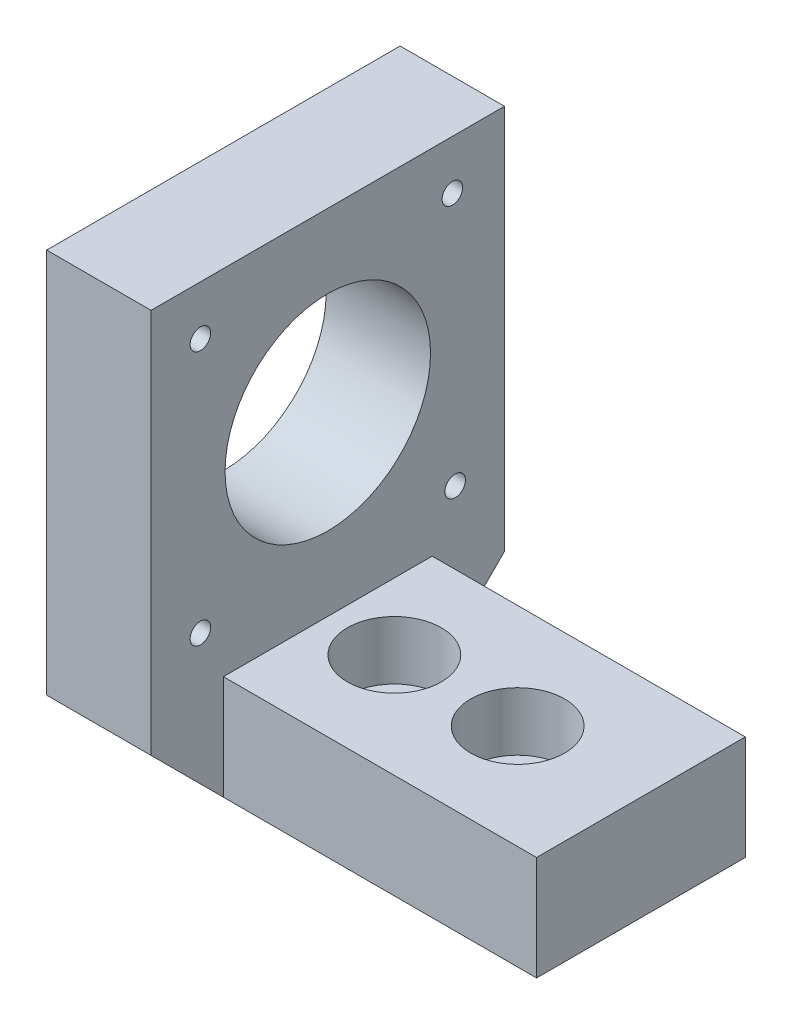
ISO-10303-21;
HEADER;
FILE_DESCRIPTION(('STEP AP214'),'2;1');
FILE_NAME('part.step','',(''),(''),'','','');
FILE_SCHEMA(('AUTOMOTIVE_DESIGN { 1 0 10303 214 1 1 1 1 }'));
ENDSEC;
DATA;
#1=APPLICATION_CONTEXT('core data for automotive mechanical design processes');
#2=APPLICATION_PROTOCOL_DEFINITION('international standard','automotive_design',2000,#1);
#3=PRODUCT_CONTEXT('',#1,'mechanical');
#4=PRODUCT('Part','Part','',(#3));
#5=PRODUCT_RELATED_PRODUCT_CATEGORY('part','',(#4));
#6=PRODUCT_DEFINITION_FORMATION('','',#4);
#7=PRODUCT_DEFINITION_CONTEXT('part definition',#1,'design');
#8=PRODUCT_DEFINITION('design','',#6,#7);
#9=PRODUCT_DEFINITION_SHAPE('','',#8);
#10=(LENGTH_UNIT() NAMED_UNIT(*) SI_UNIT(.MILLI.,.METRE.));
#11=(NAMED_UNIT(*) PLANE_ANGLE_UNIT() SI_UNIT($,.RADIAN.));
#12=(NAMED_UNIT(*) SI_UNIT($,.STERADIAN.) SOLID_ANGLE_UNIT());
#13=UNCERTAINTY_MEASURE_WITH_UNIT(LENGTH_MEASURE(1.E-05),#10,'distance_accuracy_value','');
#14=(GEOMETRIC_REPRESENTATION_CONTEXT(3) GLOBAL_UNCERTAINTY_ASSIGNED_CONTEXT((#13)) GLOBAL_UNIT_ASSIGNED_CONTEXT((#10,
#11,#12)) REPRESENTATION_CONTEXT('',''));
#15=CARTESIAN_POINT('',(0.,0.,0.));
#16=DIRECTION('',(0.,0.,1.));
#17=DIRECTION('',(1.,0.,0.));
#18=AXIS2_PLACEMENT_3D('',#15,#16,#17);
#19=CARTESIAN_POINT('',(10.4,12.7,0.));
#20=DIRECTION('',(0.,1.,0.));
#21=DIRECTION('',(0.,0.,1.));
#22=AXIS2_PLACEMENT_3D('',#19,#20,#21);
#23=CYLINDRICAL_SURFACE('',#22,3.3782);
#24=CARTESIAN_POINT('',(10.4,0.,0.));
#25=DIRECTION('',(0.,1.,0.));
#26=DIRECTION('',(0.,0.,1.));
#27=AXIS2_PLACEMENT_3D('',#24,#25,#26);
#28=CIRCLE('',#27,3.3782);
#29=CARTESIAN_POINT('',(10.4,0.,3.3782));
#30=VERTEX_POINT('',#29);
#31=EDGE_CURVE('E268',#30,#30,#28,.T.);
#32=ORIENTED_EDGE('',*,*,#31,.F.);
#33=EDGE_LOOP('',(#32));
#34=FACE_BOUND('',#33,.T.);
#35=CARTESIAN_POINT('',(10.4,5.588,0.));
#36=DIRECTION('',(0.,1.,0.));
#37=DIRECTION('',(0.,0.,1.));
#38=AXIS2_PLACEMENT_3D('',#35,#36,#37);
#39=CIRCLE('',#38,3.3782);
#40=CARTESIAN_POINT('',(10.4,5.588,3.3782));
#41=VERTEX_POINT('',#40);
#42=EDGE_CURVE('E52',#41,#41,#39,.F.);
#43=ORIENTED_EDGE('',*,*,#42,.F.);
#44=EDGE_LOOP('',(#43));
#45=FACE_BOUND('',#44,.T.);
#46=ADVANCED_FACE('F47',(#34,#45),#23,.F.);
#47=CARTESIAN_POINT('',(-4.6,12.7,0.));
#48=DIRECTION('',(0.,1.,0.));
#49=DIRECTION('',(0.,0.,1.));
#50=AXIS2_PLACEMENT_3D('',#47,#48,#49);
#51=CYLINDRICAL_SURFACE('',#50,3.3782);
#52=CARTESIAN_POINT('',(-4.6,0.,0.));
#53=DIRECTION('',(0.,1.,0.));
#54=DIRECTION('',(0.,0.,1.));
#55=AXIS2_PLACEMENT_3D('',#52,#53,#54);
#56=CIRCLE('',#55,3.3782);
#57=CARTESIAN_POINT('',(-4.6,0.,3.3782));
#58=VERTEX_POINT('',#57);
#59=EDGE_CURVE('E247',#58,#58,#56,.T.);
#60=ORIENTED_EDGE('',*,*,#59,.F.);
#61=EDGE_LOOP('',(#60));
#62=FACE_BOUND('',#61,.T.);
#63=CARTESIAN_POINT('',(-4.6,5.588,0.));
#64=DIRECTION('',(0.,1.,0.));
#65=DIRECTION('',(0.,0.,1.));
#66=AXIS2_PLACEMENT_3D('',#63,#64,#65);
#67=CIRCLE('',#66,3.3782);
#68=CARTESIAN_POINT('',(-4.6,5.588,3.3782));
#69=VERTEX_POINT('',#68);
#70=EDGE_CURVE('E238',#69,#69,#67,.F.);
#71=ORIENTED_EDGE('',*,*,#70,.F.);
#72=EDGE_LOOP('',(#71));
#73=FACE_BOUND('',#72,.T.);
#74=ADVANCED_FACE('F318',(#62,#73),#51,.F.);
#75=CARTESIAN_POINT('',(0.,0.,0.));
#76=DIRECTION('',(0.,-1.,0.));
#77=DIRECTION('',(0.,0.,-1.));
#78=AXIS2_PLACEMENT_3D('',#75,#76,#77);
#79=PLANE('',#78);
#80=ORIENTED_EDGE('',*,*,#59,.T.);
#81=EDGE_LOOP('',(#80));
#82=FACE_BOUND('',#81,.T.);
#83=DIRECTION('',(0.,0.,-1.));
#84=VECTOR('',#83,1.);
#85=CARTESIAN_POINT('',(25.4,0.,12.7));
#86=LINE('',#85,#84);
#87=CARTESIAN_POINT('',(25.4,0.,12.7));
#88=VERTEX_POINT('',#87);
#89=CARTESIAN_POINT('',(25.4,0.,-12.7));
#90=VERTEX_POINT('',#89);
#91=EDGE_CURVE('E166',#88,#90,#86,.T.);
#92=ORIENTED_EDGE('',*,*,#91,.F.);
#93=DIRECTION('',(1.,0.,0.));
#94=VECTOR('',#93,1.);
#95=CARTESIAN_POINT('',(-25.4,0.,12.7));
#96=LINE('',#95,#94);
#97=CARTESIAN_POINT('',(-12.7,0.,12.7));
#98=VERTEX_POINT('',#97);
#99=EDGE_CURVE('E193',#98,#88,#96,.T.);
#100=ORIENTED_EDGE('',*,*,#99,.F.);
#101=CARTESIAN_POINT('',(-25.4,0.,12.7));
#102=VERTEX_POINT('',#101);
#103=EDGE_CURVE('E173',#102,#98,#96,.T.);
#104=ORIENTED_EDGE('',*,*,#103,.F.);
#105=DIRECTION('',(0.,0.,1.));
#106=VECTOR('',#105,1.);
#107=CARTESIAN_POINT('',(-25.4,0.,12.7));
#108=LINE('',#107,#106);
#109=CARTESIAN_POINT('',(-25.4,0.,-12.7));
#110=VERTEX_POINT('',#109);
#111=EDGE_CURVE('E189',#110,#102,#108,.T.);
#112=ORIENTED_EDGE('',*,*,#111,.F.);
#113=DIRECTION('',(-1.,0.,0.));
#114=VECTOR('',#113,1.);
#115=CARTESIAN_POINT('',(-25.4,0.,-12.7));
#116=LINE('',#115,#114);
#117=CARTESIAN_POINT('',(-12.7,0.,-12.7));
#118=VERTEX_POINT('',#117);
#119=EDGE_CURVE('E184',#118,#110,#116,.T.);
#120=ORIENTED_EDGE('',*,*,#119,.F.);
#121=EDGE_CURVE('E185',#90,#118,#116,.T.);
#122=ORIENTED_EDGE('',*,*,#121,.F.);
#123=EDGE_LOOP('',(#92,#100,#104,#112,#120,#122));
#124=FACE_BOUND('',#123,.T.);
#125=ORIENTED_EDGE('',*,*,#31,.T.);
#126=EDGE_LOOP('',(#125));
#127=FACE_BOUND('',#126,.T.);
#128=ADVANCED_FACE('F325',(#82,#124,#127),#79,.T.);
#129=CARTESIAN_POINT('',(25.4,12.7,12.7));
#130=DIRECTION('',(-1.,0.,0.));
#131=DIRECTION('',(0.,0.,1.));
#132=AXIS2_PLACEMENT_3D('',#129,#130,#131);
#133=PLANE('',#132);
#134=ORIENTED_EDGE('',*,*,#91,.T.);
#135=DIRECTION('',(0.,-1.,0.));
#136=VECTOR('',#135,1.);
#137=CARTESIAN_POINT('',(25.4,12.7,-12.7));
#138=LINE('',#137,#136);
#139=CARTESIAN_POINT('',(25.4,12.7,-12.7));
#140=VERTEX_POINT('',#139);
#141=EDGE_CURVE('E158',#140,#90,#138,.T.);
#142=ORIENTED_EDGE('',*,*,#141,.F.);
#143=DIRECTION('',(0.,0.,-1.));
#144=VECTOR('',#143,1.);
#145=CARTESIAN_POINT('',(25.4,12.7,12.7));
#146=LINE('',#145,#144);
#147=CARTESIAN_POINT('',(25.4,12.7,12.7));
#148=VERTEX_POINT('',#147);
#149=EDGE_CURVE('E168',#148,#140,#146,.T.);
#150=ORIENTED_EDGE('',*,*,#149,.F.);
#151=DIRECTION('',(0.,-1.,0.));
#152=VECTOR('',#151,1.);
#153=CARTESIAN_POINT('',(25.4,12.7,12.7));
#154=LINE('',#153,#152);
#155=EDGE_CURVE('E180',#148,#88,#154,.T.);
#156=ORIENTED_EDGE('',*,*,#155,.T.);
#157=EDGE_LOOP('',(#134,#142,#150,#156));
#158=FACE_BOUND('',#157,.T.);
#159=ADVANCED_FACE('F312',(#158),#133,.F.);
#160=CARTESIAN_POINT('',(-25.4,12.7,-12.7));
#161=DIRECTION('',(0.,0.,1.));
#162=DIRECTION('',(1.,0.,0.));
#163=AXIS2_PLACEMENT_3D('',#160,#161,#162);
#164=PLANE('',#163);
#165=ORIENTED_EDGE('',*,*,#121,.T.);
#166=DIRECTION('',(0.,1.,0.));
#167=VECTOR('',#166,1.);
#168=CARTESIAN_POINT('',(-12.7,12.7,-12.7));
#169=LINE('',#168,#167);
#170=CARTESIAN_POINT('',(-12.7,12.7,-12.7));
#171=VERTEX_POINT('',#170);
#172=EDGE_CURVE('E206',#118,#171,#169,.T.);
#173=ORIENTED_EDGE('',*,*,#172,.T.);
#174=DIRECTION('',(-1.,0.,0.));
#175=VECTOR('',#174,1.);
#176=CARTESIAN_POINT('',(-25.4,12.7,-12.7));
#177=LINE('',#176,#175);
#178=EDGE_CURVE('E172',#140,#171,#177,.T.);
#179=ORIENTED_EDGE('',*,*,#178,.F.);
#180=ORIENTED_EDGE('',*,*,#141,.T.);
#181=EDGE_LOOP('',(#165,#173,#179,#180));
#182=FACE_BOUND('',#181,.T.);
#183=ADVANCED_FACE('F300',(#182),#164,.F.);
#184=CARTESIAN_POINT('',(-25.4,12.7,12.7));
#185=DIRECTION('',(1.,0.,0.));
#186=DIRECTION('',(0.,0.,-1.));
#187=AXIS2_PLACEMENT_3D('',#184,#185,#186);
#188=PLANE('',#187);
#189=CARTESIAN_POINT('',(-25.4,49.7,-15.1608250543533));
#190=DIRECTION('',(-1.,0.,0.));
#191=DIRECTION('',(0.,0.,1.));
#192=AXIS2_PLACEMENT_3D('',#189,#190,#191);
#193=CIRCLE('',#192,1.25);
#194=CARTESIAN_POINT('',(-25.4,49.7,-13.9108250543533));
#195=VERTEX_POINT('',#194);
#196=EDGE_CURVE('E237',#195,#195,#193,.T.);
#197=ORIENTED_EDGE('',*,*,#196,.F.);
#198=EDGE_LOOP('',(#197));
#199=FACE_BOUND('',#198,.T.);
#200=CARTESIAN_POINT('',(-25.4,49.7,15.5));
#201=DIRECTION('',(-1.,0.,0.));
#202=DIRECTION('',(0.,0.,1.));
#203=AXIS2_PLACEMENT_3D('',#200,#201,#202);
#204=CIRCLE('',#203,1.25);
#205=CARTESIAN_POINT('',(-25.4,49.7,16.75));
#206=VERTEX_POINT('',#205);
#207=EDGE_CURVE('E233',#206,#206,#204,.T.);
#208=ORIENTED_EDGE('',*,*,#207,.F.);
#209=EDGE_LOOP('',(#208));
#210=FACE_BOUND('',#209,.T.);
#211=CARTESIAN_POINT('',(-25.4,18.7,15.5));
#212=DIRECTION('',(-1.,0.,0.));
#213=DIRECTION('',(0.,0.,1.));
#214=AXIS2_PLACEMENT_3D('',#211,#212,#213);
#215=CIRCLE('',#214,1.25);
#216=CARTESIAN_POINT('',(-25.4,18.7,16.75));
#217=VERTEX_POINT('',#216);
#218=EDGE_CURVE('E228',#217,#217,#215,.T.);
#219=ORIENTED_EDGE('',*,*,#218,.F.);
#220=EDGE_LOOP('',(#219));
#221=FACE_BOUND('',#220,.T.);
#222=CARTESIAN_POINT('',(-25.4,18.7,-15.5));
#223=DIRECTION('',(-1.,0.,0.));
#224=DIRECTION('',(0.,0.,1.));
#225=AXIS2_PLACEMENT_3D('',#222,#223,#224);
#226=CIRCLE('',#225,1.25);
#227=CARTESIAN_POINT('',(-25.4,18.7,-14.25));
#228=VERTEX_POINT('',#227);
#229=EDGE_CURVE('E227',#228,#228,#226,.T.);
#230=ORIENTED_EDGE('',*,*,#229,.F.);
#231=EDGE_LOOP('',(#230));
#232=FACE_BOUND('',#231,.T.);
#233=ORIENTED_EDGE('',*,*,#111,.T.);
#234=DIRECTION('',(0.,0.707106781186544,0.707106781186551));
#235=VECTOR('',#234,1.);
#236=CARTESIAN_POINT('',(-25.4,6.34999999999989,19.05));
#237=LINE('',#236,#235);
#238=CARTESIAN_POINT('',(-25.4,8.79999999999982,21.5));
#239=VERTEX_POINT('',#238);
#240=EDGE_CURVE('E214',#102,#239,#237,.T.);
#241=ORIENTED_EDGE('',*,*,#240,.T.);
#242=DIRECTION('',(0.,1.,0.));
#243=VECTOR('',#242,1.);
#244=CARTESIAN_POINT('',(-25.4,12.7,21.5));
#245=LINE('',#244,#243);
#246=CARTESIAN_POINT('',(-25.4,55.7,21.5));
#247=VERTEX_POINT('',#246);
#248=EDGE_CURVE('E159',#239,#247,#245,.T.);
#249=ORIENTED_EDGE('',*,*,#248,.T.);
#250=DIRECTION('',(0.,0.,-1.));
#251=VECTOR('',#250,1.);
#252=CARTESIAN_POINT('',(-25.4,55.7,-21.5));
#253=LINE('',#252,#251);
#254=CARTESIAN_POINT('',(-25.4,55.7,-21.5));
#255=VERTEX_POINT('',#254);
#256=EDGE_CURVE('E126',#247,#255,#253,.T.);
#257=ORIENTED_EDGE('',*,*,#256,.T.);
#258=DIRECTION('',(0.,-1.,0.));
#259=VECTOR('',#258,1.);
#260=CARTESIAN_POINT('',(-25.4,12.7,-21.5));
#261=LINE('',#260,#259);
#262=CARTESIAN_POINT('',(-25.4,8.79999999999982,-21.5));
#263=VERTEX_POINT('',#262);
#264=EDGE_CURVE('E74',#255,#263,#261,.T.);
#265=ORIENTED_EDGE('',*,*,#264,.T.);
#266=DIRECTION('',(0.,-0.707106781186544,0.707106781186551));
#267=VECTOR('',#266,1.);
#268=CARTESIAN_POINT('',(-25.4,-6.35000000000011,-6.34999999999991));
#269=LINE('',#268,#267);
#270=EDGE_CURVE('E58',#263,#110,#269,.T.);
#271=ORIENTED_EDGE('',*,*,#270,.T.);
#272=EDGE_LOOP('',(#233,#241,#249,#257,#265,#271));
#273=FACE_BOUND('',#272,.T.);
#274=CARTESIAN_POINT('',(-25.4,34.2,0.));
#275=DIRECTION('',(-1.,0.,0.));
#276=DIRECTION('',(0.,0.,1.));
#277=AXIS2_PLACEMENT_3D('',#274,#275,#276);
#278=CIRCLE('',#277,12.5);
#279=CARTESIAN_POINT('',(-25.4,34.2,12.5));
#280=VERTEX_POINT('',#279);
#281=EDGE_CURVE('E148',#280,#280,#278,.T.);
#282=ORIENTED_EDGE('',*,*,#281,.F.);
#283=EDGE_LOOP('',(#282));
#284=FACE_BOUND('',#283,.T.);
#285=ADVANCED_FACE('F297',(#199,#210,#221,#232,#273,#284),#188,.F.);
#286=CARTESIAN_POINT('',(-25.4,12.7,12.7));
#287=DIRECTION('',(0.,0.,-1.));
#288=DIRECTION('',(-1.,0.,0.));
#289=AXIS2_PLACEMENT_3D('',#286,#287,#288);
#290=PLANE('',#289);
#291=DIRECTION('',(1.,0.,0.));
#292=VECTOR('',#291,1.);
#293=CARTESIAN_POINT('',(-25.4,12.7,12.7));
#294=LINE('',#293,#292);
#295=CARTESIAN_POINT('',(-12.7,12.7,12.7));
#296=VERTEX_POINT('',#295);
#297=EDGE_CURVE('E177',#296,#148,#294,.T.);
#298=ORIENTED_EDGE('',*,*,#297,.F.);
#299=DIRECTION('',(0.,-1.,0.));
#300=VECTOR('',#299,1.);
#301=CARTESIAN_POINT('',(-12.7,12.7,12.7));
#302=LINE('',#301,#300);
#303=EDGE_CURVE('E157',#296,#98,#302,.T.);
#304=ORIENTED_EDGE('',*,*,#303,.T.);
#305=ORIENTED_EDGE('',*,*,#99,.T.);
#306=ORIENTED_EDGE('',*,*,#155,.F.);
#307=EDGE_LOOP('',(#298,#304,#305,#306));
#308=FACE_BOUND('',#307,.T.);
#309=ADVANCED_FACE('F299',(#308),#290,.F.);
#310=CARTESIAN_POINT('',(0.,12.7,0.));
#311=DIRECTION('',(0.,-1.,0.));
#312=DIRECTION('',(0.,0.,-1.));
#313=AXIS2_PLACEMENT_3D('',#310,#311,#312);
#314=PLANE('',#313);
#315=CARTESIAN_POINT('',(-4.6,12.7,0.));
#316=DIRECTION('',(0.,1.,0.));
#317=DIRECTION('',(0.,0.,1.));
#318=AXIS2_PLACEMENT_3D('',#315,#316,#317);
#319=CIRCLE('',#318,5.715);
#320=CARTESIAN_POINT('',(-4.6,12.7,5.715));
#321=VERTEX_POINT('',#320);
#322=EDGE_CURVE('E249',#321,#321,#319,.T.);
#323=ORIENTED_EDGE('',*,*,#322,.F.);
#324=EDGE_LOOP('',(#323));
#325=FACE_BOUND('',#324,.T.);
#326=CARTESIAN_POINT('',(10.4,12.7,0.));
#327=DIRECTION('',(0.,1.,0.));
#328=DIRECTION('',(0.,0.,1.));
#329=AXIS2_PLACEMENT_3D('',#326,#327,#328);
#330=CIRCLE('',#329,5.715);
#331=CARTESIAN_POINT('',(10.4,12.7,5.715));
#332=VERTEX_POINT('',#331);
#333=EDGE_CURVE('E255',#332,#332,#330,.T.);
#334=ORIENTED_EDGE('',*,*,#333,.F.);
#335=EDGE_LOOP('',(#334));
#336=FACE_BOUND('',#335,.T.);
#337=ORIENTED_EDGE('',*,*,#178,.T.);
#338=DIRECTION('',(0.,0.,1.));
#339=VECTOR('',#338,1.);
#340=CARTESIAN_POINT('',(-12.7,12.7,-21.5));
#341=LINE('',#340,#339);
#342=EDGE_CURVE('E153',#171,#296,#341,.T.);
#343=ORIENTED_EDGE('',*,*,#342,.T.);
#344=ORIENTED_EDGE('',*,*,#297,.T.);
#345=ORIENTED_EDGE('',*,*,#149,.T.);
#346=EDGE_LOOP('',(#337,#343,#344,#345));
#347=FACE_BOUND('',#346,.T.);
#348=ADVANCED_FACE('F308',(#325,#336,#347),#314,.F.);
#349=CARTESIAN_POINT('',(-12.7,12.7,21.5));
#350=DIRECTION('',(0.,0.,1.));
#351=DIRECTION('',(0.,-1.,0.));
#352=AXIS2_PLACEMENT_3D('',#349,#350,#351);
#353=PLANE('',#352);
#354=ORIENTED_EDGE('',*,*,#248,.F.);
#355=DIRECTION('',(1.,0.,0.));
#356=VECTOR('',#355,1.);
#357=CARTESIAN_POINT('',(-12.7,8.79999999999981,21.5));
#358=LINE('',#357,#356);
#359=CARTESIAN_POINT('',(-12.7,8.79999999999982,21.5));
#360=VERTEX_POINT('',#359);
#361=EDGE_CURVE('E141',#239,#360,#358,.T.);
#362=ORIENTED_EDGE('',*,*,#361,.T.);
#363=DIRECTION('',(0.,1.,0.));
#364=VECTOR('',#363,1.);
#365=CARTESIAN_POINT('',(-12.7,12.7,21.5));
#366=LINE('',#365,#364);
#367=CARTESIAN_POINT('',(-12.7,55.7,21.5));
#368=VERTEX_POINT('',#367);
#369=EDGE_CURVE('E135',#360,#368,#366,.T.);
#370=ORIENTED_EDGE('',*,*,#369,.T.);
#371=DIRECTION('',(-1.,0.,0.));
#372=VECTOR('',#371,1.);
#373=CARTESIAN_POINT('',(-12.7,55.7,21.5));
#374=LINE('',#373,#372);
#375=EDGE_CURVE('E122',#368,#247,#374,.T.);
#376=ORIENTED_EDGE('',*,*,#375,.T.);
#377=EDGE_LOOP('',(#354,#362,#370,#376));
#378=FACE_BOUND('',#377,.T.);
#379=ADVANCED_FACE('F139',(#378),#353,.T.);
#380=CARTESIAN_POINT('',(-12.7,12.7,-21.5));
#381=DIRECTION('',(0.,0.,-1.));
#382=DIRECTION('',(0.,1.,0.));
#383=AXIS2_PLACEMENT_3D('',#380,#381,#382);
#384=PLANE('',#383);
#385=ORIENTED_EDGE('',*,*,#264,.F.);
#386=DIRECTION('',(-1.,0.,0.));
#387=VECTOR('',#386,1.);
#388=CARTESIAN_POINT('',(-12.7,55.7,-21.5));
#389=LINE('',#388,#387);
#390=CARTESIAN_POINT('',(-12.7,55.7,-21.5));
#391=VERTEX_POINT('',#390);
#392=EDGE_CURVE('E131',#391,#255,#389,.T.);
#393=ORIENTED_EDGE('',*,*,#392,.F.);
#394=DIRECTION('',(0.,-1.,0.));
#395=VECTOR('',#394,1.);
#396=CARTESIAN_POINT('',(-12.7,12.7,-21.5));
#397=LINE('',#396,#395);
#398=CARTESIAN_POINT('',(-12.7,8.79999999999982,-21.5));
#399=VERTEX_POINT('',#398);
#400=EDGE_CURVE('E66',#391,#399,#397,.T.);
#401=ORIENTED_EDGE('',*,*,#400,.T.);
#402=DIRECTION('',(-1.,0.,0.));
#403=VECTOR('',#402,1.);
#404=CARTESIAN_POINT('',(-12.7,8.79999999999982,-21.5));
#405=LINE('',#404,#403);
#406=EDGE_CURVE('E218',#399,#263,#405,.T.);
#407=ORIENTED_EDGE('',*,*,#406,.T.);
#408=EDGE_LOOP('',(#385,#393,#401,#407));
#409=FACE_BOUND('',#408,.T.);
#410=ADVANCED_FACE('F355',(#409),#384,.T.);
#411=CARTESIAN_POINT('',(-12.7,55.7,-21.5));
#412=DIRECTION('',(0.,1.,0.));
#413=DIRECTION('',(0.,0.,1.));
#414=AXIS2_PLACEMENT_3D('',#411,#412,#413);
#415=PLANE('',#414);
#416=ORIENTED_EDGE('',*,*,#256,.F.);
#417=ORIENTED_EDGE('',*,*,#375,.F.);
#418=DIRECTION('',(0.,0.,-1.));
#419=VECTOR('',#418,1.);
#420=CARTESIAN_POINT('',(-12.7,55.7,-21.5));
#421=LINE('',#420,#419);
#422=EDGE_CURVE('E125',#368,#391,#421,.T.);
#423=ORIENTED_EDGE('',*,*,#422,.T.);
#424=ORIENTED_EDGE('',*,*,#392,.T.);
#425=EDGE_LOOP('',(#416,#417,#423,#424));
#426=FACE_BOUND('',#425,.T.);
#427=ADVANCED_FACE('F124',(#426),#415,.T.);
#428=CARTESIAN_POINT('',(-12.7,0.,0.));
#429=DIRECTION('',(1.,0.,0.));
#430=DIRECTION('',(0.,0.,-1.));
#431=AXIS2_PLACEMENT_3D('',#428,#429,#430);
#432=PLANE('',#431);
#433=CARTESIAN_POINT('',(-12.7,49.7,-15.1608250543533));
#434=DIRECTION('',(1.,0.,0.));
#435=DIRECTION('',(0.,0.,-1.));
#436=AXIS2_PLACEMENT_3D('',#433,#434,#435);
#437=CIRCLE('',#436,1.25);
#438=CARTESIAN_POINT('',(-12.7,49.7,-16.4108250543533));
#439=VERTEX_POINT('',#438);
#440=EDGE_CURVE('E234',#439,#439,#437,.T.);
#441=ORIENTED_EDGE('',*,*,#440,.F.);
#442=EDGE_LOOP('',(#441));
#443=FACE_BOUND('',#442,.T.);
#444=CARTESIAN_POINT('',(-12.7,49.7,15.5));
#445=DIRECTION('',(1.,0.,0.));
#446=DIRECTION('',(0.,0.,-1.));
#447=AXIS2_PLACEMENT_3D('',#444,#445,#446);
#448=CIRCLE('',#447,1.25);
#449=CARTESIAN_POINT('',(-12.7,49.7,14.25));
#450=VERTEX_POINT('',#449);
#451=EDGE_CURVE('E229',#450,#450,#448,.T.);
#452=ORIENTED_EDGE('',*,*,#451,.F.);
#453=EDGE_LOOP('',(#452));
#454=FACE_BOUND('',#453,.T.);
#455=CARTESIAN_POINT('',(-12.7,18.7,15.5));
#456=DIRECTION('',(1.,0.,0.));
#457=DIRECTION('',(0.,0.,-1.));
#458=AXIS2_PLACEMENT_3D('',#455,#456,#457);
#459=CIRCLE('',#458,1.25);
#460=CARTESIAN_POINT('',(-12.7,18.7,14.25));
#461=VERTEX_POINT('',#460);
#462=EDGE_CURVE('E223',#461,#461,#459,.T.);
#463=ORIENTED_EDGE('',*,*,#462,.F.);
#464=EDGE_LOOP('',(#463));
#465=FACE_BOUND('',#464,.T.);
#466=CARTESIAN_POINT('',(-12.7,18.7,-15.5));
#467=DIRECTION('',(1.,0.,0.));
#468=DIRECTION('',(0.,0.,-1.));
#469=AXIS2_PLACEMENT_3D('',#466,#467,#468);
#470=CIRCLE('',#469,1.25);
#471=CARTESIAN_POINT('',(-12.7,18.7,-16.75));
#472=VERTEX_POINT('',#471);
#473=EDGE_CURVE('E284',#472,#472,#470,.T.);
#474=ORIENTED_EDGE('',*,*,#473,.F.);
#475=EDGE_LOOP('',(#474));
#476=FACE_BOUND('',#475,.T.);
#477=CARTESIAN_POINT('',(-12.7,34.2,0.));
#478=DIRECTION('',(-1.,0.,0.));
#479=DIRECTION('',(0.,0.,1.));
#480=AXIS2_PLACEMENT_3D('',#477,#478,#479);
#481=CIRCLE('',#480,12.5);
#482=CARTESIAN_POINT('',(-12.7,34.2,12.5));
#483=VERTEX_POINT('',#482);
#484=EDGE_CURVE('E162',#483,#483,#481,.T.);
#485=ORIENTED_EDGE('',*,*,#484,.T.);
#486=EDGE_LOOP('',(#485));
#487=FACE_BOUND('',#486,.T.);
#488=ORIENTED_EDGE('',*,*,#369,.F.);
#489=DIRECTION('',(0.,-0.707106781186544,-0.707106781186551));
#490=VECTOR('',#489,1.);
#491=CARTESIAN_POINT('',(-12.7,12.7,25.4000000000002));
#492=LINE('',#491,#490);
#493=EDGE_CURVE('E211',#360,#98,#492,.T.);
#494=ORIENTED_EDGE('',*,*,#493,.T.);
#495=ORIENTED_EDGE('',*,*,#303,.F.);
#496=ORIENTED_EDGE('',*,*,#342,.F.);
#497=ORIENTED_EDGE('',*,*,#172,.F.);
#498=DIRECTION('',(0.,0.707106781186544,-0.707106781186551));
#499=VECTOR('',#498,1.);
#500=CARTESIAN_POINT('',(-12.7,12.7,-25.4000000000002));
#501=LINE('',#500,#499);
#502=EDGE_CURVE('E11',#118,#399,#501,.T.);
#503=ORIENTED_EDGE('',*,*,#502,.T.);
#504=ORIENTED_EDGE('',*,*,#400,.F.);
#505=ORIENTED_EDGE('',*,*,#422,.F.);
#506=EDGE_LOOP('',(#488,#494,#495,#496,#497,#503,#504,#505));
#507=FACE_BOUND('',#506,.T.);
#508=ADVANCED_FACE('F134',(#443,#454,#465,#476,#487,#507),#432,.T.);
#509=CARTESIAN_POINT('',(-12.7,34.2,0.));
#510=DIRECTION('',(-1.,0.,0.));
#511=DIRECTION('',(0.,0.,1.));
#512=AXIS2_PLACEMENT_3D('',#509,#510,#511);
#513=CYLINDRICAL_SURFACE('',#512,12.5);
#514=ORIENTED_EDGE('',*,*,#484,.F.);
#515=EDGE_LOOP('',(#514));
#516=FACE_BOUND('',#515,.T.);
#517=ORIENTED_EDGE('',*,*,#281,.T.);
#518=EDGE_LOOP('',(#517));
#519=FACE_BOUND('',#518,.T.);
#520=ADVANCED_FACE('F295',(#516,#519),#513,.F.);
#521=CARTESIAN_POINT('',(-12.7,12.7,25.4000000000002));
#522=DIRECTION('',(0.,0.707106781186551,-0.707106781186544));
#523=DIRECTION('',(1.,0.,0.));
#524=AXIS2_PLACEMENT_3D('',#521,#522,#523);
#525=PLANE('',#524);
#526=ORIENTED_EDGE('',*,*,#240,.F.);
#527=ORIENTED_EDGE('',*,*,#103,.T.);
#528=ORIENTED_EDGE('',*,*,#493,.F.);
#529=ORIENTED_EDGE('',*,*,#361,.F.);
#530=EDGE_LOOP('',(#526,#527,#528,#529));
#531=FACE_BOUND('',#530,.T.);
#532=ADVANCED_FACE('F351',(#531),#525,.F.);
#533=CARTESIAN_POINT('',(-12.7,12.7,-25.4000000000002));
#534=DIRECTION('',(0.,0.707106781186551,0.707106781186544));
#535=DIRECTION('',(-1.,0.,0.));
#536=AXIS2_PLACEMENT_3D('',#533,#534,#535);
#537=PLANE('',#536);
#538=ORIENTED_EDGE('',*,*,#502,.F.);
#539=ORIENTED_EDGE('',*,*,#119,.T.);
#540=ORIENTED_EDGE('',*,*,#270,.F.);
#541=ORIENTED_EDGE('',*,*,#406,.F.);
#542=EDGE_LOOP('',(#538,#539,#540,#541));
#543=FACE_BOUND('',#542,.T.);
#544=ADVANCED_FACE('F50',(#543),#537,.F.);
#545=CARTESIAN_POINT('',(-25.4,18.7,-15.5));
#546=DIRECTION('',(-1.,0.,0.));
#547=DIRECTION('',(0.,0.,1.));
#548=AXIS2_PLACEMENT_3D('',#545,#546,#547);
#549=CYLINDRICAL_SURFACE('',#548,1.25);
#550=ORIENTED_EDGE('',*,*,#473,.T.);
#551=EDGE_LOOP('',(#550));
#552=FACE_BOUND('',#551,.T.);
#553=ORIENTED_EDGE('',*,*,#229,.T.);
#554=EDGE_LOOP('',(#553));
#555=FACE_BOUND('',#554,.T.);
#556=ADVANCED_FACE('F344',(#552,#555),#549,.F.);
#557=CARTESIAN_POINT('',(-25.4,18.7,15.5));
#558=DIRECTION('',(-1.,0.,0.));
#559=DIRECTION('',(0.,0.,1.));
#560=AXIS2_PLACEMENT_3D('',#557,#558,#559);
#561=CYLINDRICAL_SURFACE('',#560,1.25);
#562=ORIENTED_EDGE('',*,*,#462,.T.);
#563=EDGE_LOOP('',(#562));
#564=FACE_BOUND('',#563,.T.);
#565=ORIENTED_EDGE('',*,*,#218,.T.);
#566=EDGE_LOOP('',(#565));
#567=FACE_BOUND('',#566,.T.);
#568=ADVANCED_FACE('F340',(#564,#567),#561,.F.);
#569=CARTESIAN_POINT('',(-25.4,49.7,15.5));
#570=DIRECTION('',(-1.,0.,0.));
#571=DIRECTION('',(0.,0.,1.));
#572=AXIS2_PLACEMENT_3D('',#569,#570,#571);
#573=CYLINDRICAL_SURFACE('',#572,1.25);
#574=ORIENTED_EDGE('',*,*,#451,.T.);
#575=EDGE_LOOP('',(#574));
#576=FACE_BOUND('',#575,.T.);
#577=ORIENTED_EDGE('',*,*,#207,.T.);
#578=EDGE_LOOP('',(#577));
#579=FACE_BOUND('',#578,.T.);
#580=ADVANCED_FACE('F336',(#576,#579),#573,.F.);
#581=CARTESIAN_POINT('',(-25.4,49.7,-15.1608250543533));
#582=DIRECTION('',(-1.,0.,0.));
#583=DIRECTION('',(0.,0.,1.));
#584=AXIS2_PLACEMENT_3D('',#581,#582,#583);
#585=CYLINDRICAL_SURFACE('',#584,1.25);
#586=ORIENTED_EDGE('',*,*,#440,.T.);
#587=EDGE_LOOP('',(#586));
#588=FACE_BOUND('',#587,.T.);
#589=ORIENTED_EDGE('',*,*,#196,.T.);
#590=EDGE_LOOP('',(#589));
#591=FACE_BOUND('',#590,.T.);
#592=ADVANCED_FACE('F332',(#588,#591),#585,.F.);
#593=CARTESIAN_POINT('',(-4.6,5.588,0.));
#594=DIRECTION('',(0.,1.,0.));
#595=DIRECTION('',(0.,0.,1.));
#596=AXIS2_PLACEMENT_3D('',#593,#594,#595);
#597=PLANE('',#596);
#598=CARTESIAN_POINT('',(-4.6,5.588,0.));
#599=DIRECTION('',(0.,1.,0.));
#600=DIRECTION('',(0.,0.,1.));
#601=AXIS2_PLACEMENT_3D('',#598,#599,#600);
#602=CIRCLE('',#601,5.715);
#603=CARTESIAN_POINT('',(-4.6,5.588,5.715));
#604=VERTEX_POINT('',#603);
#605=EDGE_CURVE('E241',#604,#604,#602,.T.);
#606=ORIENTED_EDGE('',*,*,#605,.T.);
#607=EDGE_LOOP('',(#606));
#608=FACE_BOUND('',#607,.T.);
#609=ORIENTED_EDGE('',*,*,#70,.T.);
#610=EDGE_LOOP('',(#609));
#611=FACE_BOUND('',#610,.T.);
#612=ADVANCED_FACE('F335',(#608,#611),#597,.T.);
#613=CARTESIAN_POINT('',(-4.6,5.588,0.));
#614=DIRECTION('',(0.,1.,0.));
#615=DIRECTION('',(0.,0.,1.));
#616=AXIS2_PLACEMENT_3D('',#613,#614,#615);
#617=CYLINDRICAL_SURFACE('',#616,5.715);
#618=ORIENTED_EDGE('',*,*,#605,.F.);
#619=EDGE_LOOP('',(#618));
#620=FACE_BOUND('',#619,.T.);
#621=ORIENTED_EDGE('',*,*,#322,.T.);
#622=EDGE_LOOP('',(#621));
#623=FACE_BOUND('',#622,.T.);
#624=ADVANCED_FACE('F454',(#620,#623),#617,.F.);
#625=CARTESIAN_POINT('',(10.4,5.588,0.));
#626=DIRECTION('',(0.,1.,0.));
#627=DIRECTION('',(0.,0.,1.));
#628=AXIS2_PLACEMENT_3D('',#625,#626,#627);
#629=PLANE('',#628);
#630=CARTESIAN_POINT('',(10.4,5.588,0.));
#631=DIRECTION('',(0.,1.,0.));
#632=DIRECTION('',(0.,0.,1.));
#633=AXIS2_PLACEMENT_3D('',#630,#631,#632);
#634=CIRCLE('',#633,5.715);
#635=CARTESIAN_POINT('',(10.4,5.588,5.715));
#636=VERTEX_POINT('',#635);
#637=EDGE_CURVE('E261',#636,#636,#634,.T.);
#638=ORIENTED_EDGE('',*,*,#637,.T.);
#639=EDGE_LOOP('',(#638));
#640=FACE_BOUND('',#639,.T.);
#641=ORIENTED_EDGE('',*,*,#42,.T.);
#642=EDGE_LOOP('',(#641));
#643=FACE_BOUND('',#642,.T.);
#644=ADVANCED_FACE('F463',(#640,#643),#629,.T.);
#645=CARTESIAN_POINT('',(10.4,5.588,0.));
#646=DIRECTION('',(0.,1.,0.));
#647=DIRECTION('',(0.,0.,1.));
#648=AXIS2_PLACEMENT_3D('',#645,#646,#647);
#649=CYLINDRICAL_SURFACE('',#648,5.715);
#650=ORIENTED_EDGE('',*,*,#637,.F.);
#651=EDGE_LOOP('',(#650));
#652=FACE_BOUND('',#651,.T.);
#653=ORIENTED_EDGE('',*,*,#333,.T.);
#654=EDGE_LOOP('',(#653));
#655=FACE_BOUND('',#654,.T.);
#656=ADVANCED_FACE('F473',(#652,#655),#649,.F.);
#657=CLOSED_SHELL('',(#46,#74,#128,#159,#183,#285,#309,#348,#379,#410,#427,#508,#520,#532,#544,
#556,#568,#580,#592,#612,#624,#644,#656));
#658=MANIFOLD_SOLID_BREP('B2',#657);
#659=ADVANCED_BREP_SHAPE_REPRESENTATION('',(#18,#658),#14);
#660=SHAPE_DEFINITION_REPRESENTATION(#9,#659);
ENDSEC;
END-ISO-10303-21;
